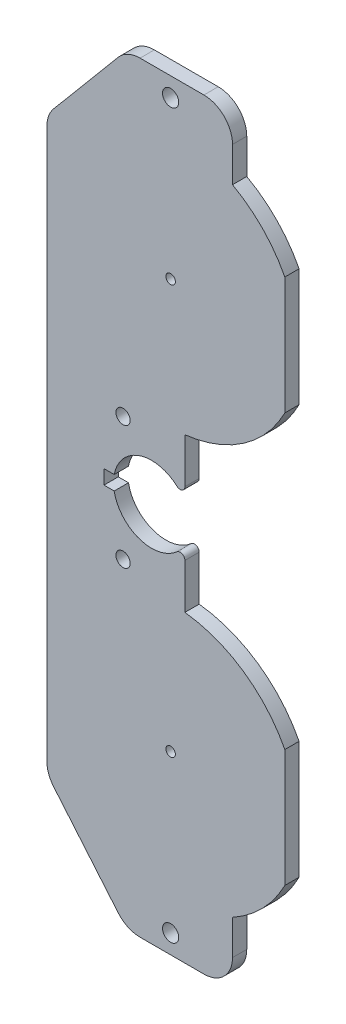
ISO-10303-21;
HEADER;
FILE_DESCRIPTION(('STEP AP214'),'2;1');
FILE_NAME('part.step','',(''),(''),'','','');
FILE_SCHEMA(('AUTOMOTIVE_DESIGN { 1 0 10303 214 1 1 1 1 }'));
ENDSEC;
DATA;
#1=APPLICATION_CONTEXT('core data for automotive mechanical design processes');
#2=APPLICATION_PROTOCOL_DEFINITION('international standard','automotive_design',2000,#1);
#3=PRODUCT_CONTEXT('',#1,'mechanical');
#4=PRODUCT('Part','Part','',(#3));
#5=PRODUCT_RELATED_PRODUCT_CATEGORY('part','',(#4));
#6=PRODUCT_DEFINITION_FORMATION('','',#4);
#7=PRODUCT_DEFINITION_CONTEXT('part definition',#1,'design');
#8=PRODUCT_DEFINITION('design','',#6,#7);
#9=PRODUCT_DEFINITION_SHAPE('','',#8);
#10=(LENGTH_UNIT() NAMED_UNIT(*) SI_UNIT(.MILLI.,.METRE.));
#11=(NAMED_UNIT(*) PLANE_ANGLE_UNIT() SI_UNIT($,.RADIAN.));
#12=(NAMED_UNIT(*) SI_UNIT($,.STERADIAN.) SOLID_ANGLE_UNIT());
#13=UNCERTAINTY_MEASURE_WITH_UNIT(LENGTH_MEASURE(1.E-05),#10,'distance_accuracy_value','');
#14=(GEOMETRIC_REPRESENTATION_CONTEXT(3) GLOBAL_UNCERTAINTY_ASSIGNED_CONTEXT((#13)) GLOBAL_UNIT_ASSIGNED_CONTEXT((#10,
#11,#12)) REPRESENTATION_CONTEXT('',''));
#15=CARTESIAN_POINT('',(0.,0.,0.));
#16=DIRECTION('',(0.,0.,1.));
#17=DIRECTION('',(1.,0.,0.));
#18=AXIS2_PLACEMENT_3D('',#15,#16,#17);
#19=CARTESIAN_POINT('',(-2.,38.,1.5));
#20=DIRECTION('',(0.,0.,-1.));
#21=DIRECTION('',(-1.,0.,0.));
#22=AXIS2_PLACEMENT_3D('',#19,#20,#21);
#23=CYLINDRICAL_SURFACE('',#22,4.);
#24=CARTESIAN_POINT('',(-2.,38.,1.5));
#25=DIRECTION('',(0.,0.,1.));
#26=DIRECTION('',(1.,0.,0.));
#27=AXIS2_PLACEMENT_3D('',#24,#25,#26);
#28=CIRCLE('',#27,4.);
#29=CARTESIAN_POINT('',(-5.92905841137543,37.25,1.5));
#30=VERTEX_POINT('',#29);
#31=CARTESIAN_POINT('',(0.666666666666667,35.0185760300003,1.5));
#32=VERTEX_POINT('',#31);
#33=EDGE_CURVE('E225',#30,#32,#28,.T.);
#34=ORIENTED_EDGE('',*,*,#33,.T.);
#35=DIRECTION('',(0.,0.,-1.));
#36=VECTOR('',#35,1.);
#37=CARTESIAN_POINT('',(0.666666666666667,35.0185760300003,1.5));
#38=LINE('',#37,#36);
#39=CARTESIAN_POINT('',(0.666666666666667,35.0185760300003,0.));
#40=VERTEX_POINT('',#39);
#41=EDGE_CURVE('E231',#32,#40,#38,.T.);
#42=ORIENTED_EDGE('',*,*,#41,.T.);
#43=CARTESIAN_POINT('',(-2.,38.,0.));
#44=DIRECTION('',(0.,0.,1.));
#45=DIRECTION('',(1.,0.,0.));
#46=AXIS2_PLACEMENT_3D('',#43,#44,#45);
#47=CIRCLE('',#46,4.);
#48=CARTESIAN_POINT('',(-5.92905841137543,37.25,0.));
#49=VERTEX_POINT('',#48);
#50=EDGE_CURVE('E228',#49,#40,#47,.T.);
#51=ORIENTED_EDGE('',*,*,#50,.F.);
#52=DIRECTION('',(0.,0.,-1.));
#53=VECTOR('',#52,1.);
#54=CARTESIAN_POINT('',(-5.92905841137543,37.25,1.5));
#55=LINE('',#54,#53);
#56=EDGE_CURVE('E221',#30,#49,#55,.T.);
#57=ORIENTED_EDGE('',*,*,#56,.F.);
#58=EDGE_LOOP('',(#34,#42,#51,#57));
#59=FACE_BOUND('',#58,.T.);
#60=ADVANCED_FACE('F37',(#59),#23,.F.);
#61=CARTESIAN_POINT('',(-2.41351910007069E-13,37.25,1.5));
#62=DIRECTION('',(0.,-1.,0.));
#63=DIRECTION('',(1.,0.,0.));
#64=AXIS2_PLACEMENT_3D('',#61,#62,#63);
#65=PLANE('',#64);
#66=DIRECTION('',(-1.,0.,0.));
#67=VECTOR('',#66,1.);
#68=CARTESIAN_POINT('',(-2.41351910007069E-13,37.25,0.));
#69=LINE('',#68,#67);
#70=CARTESIAN_POINT('',(-7.,37.25,0.));
#71=VERTEX_POINT('',#70);
#72=EDGE_CURVE('E326',#49,#71,#69,.T.);
#73=ORIENTED_EDGE('',*,*,#72,.T.);
#74=DIRECTION('',(0.,0.,-1.));
#75=VECTOR('',#74,1.);
#76=CARTESIAN_POINT('',(-7.,37.25,1.5));
#77=LINE('',#76,#75);
#78=CARTESIAN_POINT('',(-7.,37.25,1.5));
#79=VERTEX_POINT('',#78);
#80=EDGE_CURVE('E232',#79,#71,#77,.T.);
#81=ORIENTED_EDGE('',*,*,#80,.F.);
#82=DIRECTION('',(-1.,0.,0.));
#83=VECTOR('',#82,1.);
#84=CARTESIAN_POINT('',(-2.41351910007069E-13,37.25,1.5));
#85=LINE('',#84,#83);
#86=EDGE_CURVE('E235',#30,#79,#85,.T.);
#87=ORIENTED_EDGE('',*,*,#86,.F.);
#88=ORIENTED_EDGE('',*,*,#56,.T.);
#89=EDGE_LOOP('',(#73,#81,#87,#88));
#90=FACE_BOUND('',#89,.T.);
#91=ADVANCED_FACE('F236',(#90),#65,.F.);
#92=CARTESIAN_POINT('',(-7.,0.,1.5));
#93=DIRECTION('',(-1.,0.,0.));
#94=DIRECTION('',(0.,0.,1.));
#95=AXIS2_PLACEMENT_3D('',#92,#93,#94);
#96=PLANE('',#95);
#97=DIRECTION('',(0.,1.,0.));
#98=VECTOR('',#97,1.);
#99=CARTESIAN_POINT('',(-7.,0.,0.));
#100=LINE('',#99,#98);
#101=CARTESIAN_POINT('',(-7.,38.75,0.));
#102=VERTEX_POINT('',#101);
#103=EDGE_CURVE('E328',#71,#102,#100,.T.);
#104=ORIENTED_EDGE('',*,*,#103,.T.);
#105=DIRECTION('',(0.,0.,-1.));
#106=VECTOR('',#105,1.);
#107=CARTESIAN_POINT('',(-7.,38.75,1.5));
#108=LINE('',#107,#106);
#109=CARTESIAN_POINT('',(-7.,38.75,1.5));
#110=VERTEX_POINT('',#109);
#111=EDGE_CURVE('E454',#110,#102,#108,.T.);
#112=ORIENTED_EDGE('',*,*,#111,.F.);
#113=DIRECTION('',(0.,1.,0.));
#114=VECTOR('',#113,1.);
#115=CARTESIAN_POINT('',(-7.,0.,1.5));
#116=LINE('',#115,#114);
#117=EDGE_CURVE('E239',#79,#110,#116,.T.);
#118=ORIENTED_EDGE('',*,*,#117,.F.);
#119=ORIENTED_EDGE('',*,*,#80,.T.);
#120=EDGE_LOOP('',(#104,#112,#118,#119));
#121=FACE_BOUND('',#120,.T.);
#122=ADVANCED_FACE('F574',(#121),#96,.F.);
#123=CARTESIAN_POINT('',(2.51070778866413E-13,38.75,1.5));
#124=DIRECTION('',(0.,1.,0.));
#125=DIRECTION('',(-1.,0.,0.));
#126=AXIS2_PLACEMENT_3D('',#123,#124,#125);
#127=PLANE('',#126);
#128=DIRECTION('',(1.,0.,0.));
#129=VECTOR('',#128,1.);
#130=CARTESIAN_POINT('',(2.51070778866413E-13,38.75,0.));
#131=LINE('',#130,#129);
#132=CARTESIAN_POINT('',(-5.92905841137543,38.75,0.));
#133=VERTEX_POINT('',#132);
#134=EDGE_CURVE('E330',#102,#133,#131,.T.);
#135=ORIENTED_EDGE('',*,*,#134,.T.);
#136=DIRECTION('',(0.,0.,-1.));
#137=VECTOR('',#136,1.);
#138=CARTESIAN_POINT('',(-5.92905841137543,38.75,1.5));
#139=LINE('',#138,#137);
#140=CARTESIAN_POINT('',(-5.92905841137543,38.75,1.5));
#141=VERTEX_POINT('',#140);
#142=EDGE_CURVE('E451',#141,#133,#139,.T.);
#143=ORIENTED_EDGE('',*,*,#142,.F.);
#144=DIRECTION('',(1.,0.,0.));
#145=VECTOR('',#144,1.);
#146=CARTESIAN_POINT('',(2.51070778866413E-13,38.75,1.5));
#147=LINE('',#146,#145);
#148=EDGE_CURVE('E253',#110,#141,#147,.T.);
#149=ORIENTED_EDGE('',*,*,#148,.F.);
#150=ORIENTED_EDGE('',*,*,#111,.T.);
#151=EDGE_LOOP('',(#135,#143,#149,#150));
#152=FACE_BOUND('',#151,.T.);
#153=ADVANCED_FACE('F579',(#152),#127,.F.);
#154=CARTESIAN_POINT('',(-2.,38.,1.5));
#155=DIRECTION('',(0.,0.,-1.));
#156=DIRECTION('',(-1.,0.,0.));
#157=AXIS2_PLACEMENT_3D('',#154,#155,#156);
#158=CYLINDRICAL_SURFACE('',#157,4.);
#159=CARTESIAN_POINT('',(-2.,38.,0.));
#160=DIRECTION('',(0.,0.,1.));
#161=DIRECTION('',(1.,0.,0.));
#162=AXIS2_PLACEMENT_3D('',#159,#160,#161);
#163=CIRCLE('',#162,4.);
#164=CARTESIAN_POINT('',(0.666666666666667,40.9814239699997,0.));
#165=VERTEX_POINT('',#164);
#166=EDGE_CURVE('E333',#165,#133,#163,.T.);
#167=ORIENTED_EDGE('',*,*,#166,.F.);
#168=DIRECTION('',(0.,0.,-1.));
#169=VECTOR('',#168,1.);
#170=CARTESIAN_POINT('',(0.666666666666667,40.9814239699997,1.5));
#171=LINE('',#170,#169);
#172=CARTESIAN_POINT('',(0.666666666666667,40.9814239699997,1.5));
#173=VERTEX_POINT('',#172);
#174=EDGE_CURVE('E11',#165,#173,#171,.F.);
#175=ORIENTED_EDGE('',*,*,#174,.T.);
#176=CARTESIAN_POINT('',(-2.,38.,1.5));
#177=DIRECTION('',(0.,0.,1.));
#178=DIRECTION('',(1.,0.,0.));
#179=AXIS2_PLACEMENT_3D('',#176,#177,#178);
#180=CIRCLE('',#179,4.);
#181=EDGE_CURVE('E256',#173,#141,#180,.T.);
#182=ORIENTED_EDGE('',*,*,#181,.T.);
#183=ORIENTED_EDGE('',*,*,#142,.T.);
#184=EDGE_LOOP('',(#167,#175,#182,#183));
#185=FACE_BOUND('',#184,.T.);
#186=ADVANCED_FACE('F580',(#185),#158,.F.);
#187=CARTESIAN_POINT('',(1.5,0.,1.5));
#188=DIRECTION('',(-1.,0.,0.));
#189=DIRECTION('',(0.,-1.,0.));
#190=AXIS2_PLACEMENT_3D('',#187,#188,#189);
#191=PLANE('',#190);
#192=DIRECTION('',(0.,1.,0.));
#193=VECTOR('',#192,1.);
#194=CARTESIAN_POINT('',(1.5,0.,1.5));
#195=LINE('',#194,#193);
#196=CARTESIAN_POINT('',(1.5,41.3541019662497,1.5));
#197=VERTEX_POINT('',#196);
#198=CARTESIAN_POINT('',(1.5,46.0835921350013,1.5));
#199=VERTEX_POINT('',#198);
#200=EDGE_CURVE('E258',#197,#199,#195,.T.);
#201=ORIENTED_EDGE('',*,*,#200,.F.);
#202=DIRECTION('',(0.,0.,1.));
#203=VECTOR('',#202,1.);
#204=CARTESIAN_POINT('',(1.5,41.3541019662497,0.));
#205=LINE('',#204,#203);
#206=CARTESIAN_POINT('',(1.5,41.3541019662497,0.));
#207=VERTEX_POINT('',#206);
#208=EDGE_CURVE('E45',#197,#207,#205,.F.);
#209=ORIENTED_EDGE('',*,*,#208,.T.);
#210=DIRECTION('',(0.,1.,0.));
#211=VECTOR('',#210,1.);
#212=CARTESIAN_POINT('',(1.5,0.,0.));
#213=LINE('',#212,#211);
#214=CARTESIAN_POINT('',(1.5,46.0835921350013,0.));
#215=VERTEX_POINT('',#214);
#216=EDGE_CURVE('E335',#207,#215,#213,.T.);
#217=ORIENTED_EDGE('',*,*,#216,.T.);
#218=DIRECTION('',(0.,0.,-1.));
#219=VECTOR('',#218,1.);
#220=CARTESIAN_POINT('',(1.5,46.0835921350013,1.5));
#221=LINE('',#220,#219);
#222=EDGE_CURVE('E448',#199,#215,#221,.T.);
#223=ORIENTED_EDGE('',*,*,#222,.F.);
#224=EDGE_LOOP('',(#201,#209,#217,#223));
#225=FACE_BOUND('',#224,.T.);
#226=ADVANCED_FACE('F470',(#225),#191,.F.);
#227=CARTESIAN_POINT('',(0.,59.5,1.5));
#228=DIRECTION('',(0.,0.,-1.));
#229=DIRECTION('',(-1.,0.,0.));
#230=AXIS2_PLACEMENT_3D('',#227,#228,#229);
#231=CYLINDRICAL_SURFACE('',#230,13.5);
#232=CARTESIAN_POINT('',(0.,59.5,0.));
#233=DIRECTION('',(0.,0.,1.));
#234=DIRECTION('',(1.,0.,0.));
#235=AXIS2_PLACEMENT_3D('',#232,#233,#234);
#236=CIRCLE('',#235,13.5);
#237=CARTESIAN_POINT('',(12.,53.3153415615735,0.));
#238=VERTEX_POINT('',#237);
#239=EDGE_CURVE('E337',#215,#238,#236,.T.);
#240=ORIENTED_EDGE('',*,*,#239,.T.);
#241=DIRECTION('',(0.,0.,-1.));
#242=VECTOR('',#241,1.);
#243=CARTESIAN_POINT('',(12.,53.3153415615735,1.5));
#244=LINE('',#243,#242);
#245=CARTESIAN_POINT('',(12.,53.3153415615735,1.5));
#246=VERTEX_POINT('',#245);
#247=EDGE_CURVE('E445',#246,#238,#244,.T.);
#248=ORIENTED_EDGE('',*,*,#247,.F.);
#249=CARTESIAN_POINT('',(0.,59.5,1.5));
#250=DIRECTION('',(0.,0.,1.));
#251=DIRECTION('',(1.,0.,0.));
#252=AXIS2_PLACEMENT_3D('',#249,#250,#251);
#253=CIRCLE('',#252,13.5);
#254=EDGE_CURVE('E260',#199,#246,#253,.T.);
#255=ORIENTED_EDGE('',*,*,#254,.F.);
#256=ORIENTED_EDGE('',*,*,#222,.T.);
#257=EDGE_LOOP('',(#240,#248,#255,#256));
#258=FACE_BOUND('',#257,.T.);
#259=ADVANCED_FACE('F481',(#258),#231,.T.);
#260=CARTESIAN_POINT('',(12.,0.,1.5));
#261=DIRECTION('',(-1.,0.,0.));
#262=DIRECTION('',(0.,0.,1.));
#263=AXIS2_PLACEMENT_3D('',#260,#261,#262);
#264=PLANE('',#263);
#265=DIRECTION('',(0.,1.,0.));
#266=VECTOR('',#265,1.);
#267=CARTESIAN_POINT('',(12.,0.,0.));
#268=LINE('',#267,#266);
#269=CARTESIAN_POINT('',(12.,65.6846584384265,0.));
#270=VERTEX_POINT('',#269);
#271=EDGE_CURVE('E339',#238,#270,#268,.T.);
#272=ORIENTED_EDGE('',*,*,#271,.T.);
#273=DIRECTION('',(0.,0.,-1.));
#274=VECTOR('',#273,1.);
#275=CARTESIAN_POINT('',(12.,65.6846584384265,1.5));
#276=LINE('',#275,#274);
#277=CARTESIAN_POINT('',(12.,65.6846584384265,1.5));
#278=VERTEX_POINT('',#277);
#279=EDGE_CURVE('E442',#278,#270,#276,.T.);
#280=ORIENTED_EDGE('',*,*,#279,.F.);
#281=DIRECTION('',(0.,1.,0.));
#282=VECTOR('',#281,1.);
#283=CARTESIAN_POINT('',(12.,0.,1.5));
#284=LINE('',#283,#282);
#285=EDGE_CURVE('E262',#246,#278,#284,.T.);
#286=ORIENTED_EDGE('',*,*,#285,.F.);
#287=ORIENTED_EDGE('',*,*,#247,.T.);
#288=EDGE_LOOP('',(#272,#280,#286,#287));
#289=FACE_BOUND('',#288,.T.);
#290=ADVANCED_FACE('F485',(#289),#264,.F.);
#291=CARTESIAN_POINT('',(0.,59.5,1.5));
#292=DIRECTION('',(0.,0.,-1.));
#293=DIRECTION('',(-1.,0.,0.));
#294=AXIS2_PLACEMENT_3D('',#291,#292,#293);
#295=CYLINDRICAL_SURFACE('',#294,13.5);
#296=CARTESIAN_POINT('',(0.,59.5,0.));
#297=DIRECTION('',(0.,0.,1.));
#298=DIRECTION('',(1.,0.,0.));
#299=AXIS2_PLACEMENT_3D('',#296,#297,#298);
#300=CIRCLE('',#299,13.5);
#301=CARTESIAN_POINT('',(6.5,71.3321595661992,0.));
#302=VERTEX_POINT('',#301);
#303=EDGE_CURVE('E341',#270,#302,#300,.T.);
#304=ORIENTED_EDGE('',*,*,#303,.T.);
#305=DIRECTION('',(0.,0.,-1.));
#306=VECTOR('',#305,1.);
#307=CARTESIAN_POINT('',(6.5,71.3321595661992,1.5));
#308=LINE('',#307,#306);
#309=CARTESIAN_POINT('',(6.5,71.3321595661992,1.5));
#310=VERTEX_POINT('',#309);
#311=EDGE_CURVE('E439',#310,#302,#308,.T.);
#312=ORIENTED_EDGE('',*,*,#311,.F.);
#313=CARTESIAN_POINT('',(0.,59.5,1.5));
#314=DIRECTION('',(0.,0.,1.));
#315=DIRECTION('',(1.,0.,0.));
#316=AXIS2_PLACEMENT_3D('',#313,#314,#315);
#317=CIRCLE('',#316,13.5);
#318=EDGE_CURVE('E264',#278,#310,#317,.T.);
#319=ORIENTED_EDGE('',*,*,#318,.F.);
#320=ORIENTED_EDGE('',*,*,#279,.T.);
#321=EDGE_LOOP('',(#304,#312,#319,#320));
#322=FACE_BOUND('',#321,.T.);
#323=ADVANCED_FACE('F492',(#322),#295,.T.);
#324=CARTESIAN_POINT('',(6.50000000000002,0.,1.5));
#325=DIRECTION('',(-1.,0.,0.));
#326=DIRECTION('',(0.,-1.,0.));
#327=AXIS2_PLACEMENT_3D('',#324,#325,#326);
#328=PLANE('',#327);
#329=DIRECTION('',(0.,1.,0.));
#330=VECTOR('',#329,1.);
#331=CARTESIAN_POINT('',(6.50000000000002,0.,0.));
#332=LINE('',#331,#330);
#333=CARTESIAN_POINT('',(6.5,75.,0.));
#334=VERTEX_POINT('',#333);
#335=EDGE_CURVE('E343',#302,#334,#332,.T.);
#336=ORIENTED_EDGE('',*,*,#335,.T.);
#337=DIRECTION('',(0.,0.,-1.));
#338=VECTOR('',#337,1.);
#339=CARTESIAN_POINT('',(6.5,75.,1.5));
#340=LINE('',#339,#338);
#341=CARTESIAN_POINT('',(6.5,75.,1.5));
#342=VERTEX_POINT('',#341);
#343=EDGE_CURVE('E436',#342,#334,#340,.T.);
#344=ORIENTED_EDGE('',*,*,#343,.F.);
#345=DIRECTION('',(0.,1.,0.));
#346=VECTOR('',#345,1.);
#347=CARTESIAN_POINT('',(6.50000000000002,0.,1.5));
#348=LINE('',#347,#346);
#349=EDGE_CURVE('E266',#310,#342,#348,.T.);
#350=ORIENTED_EDGE('',*,*,#349,.F.);
#351=ORIENTED_EDGE('',*,*,#311,.T.);
#352=EDGE_LOOP('',(#336,#344,#350,#351));
#353=FACE_BOUND('',#352,.T.);
#354=ADVANCED_FACE('F495',(#353),#328,.F.);
#355=CARTESIAN_POINT('',(3.49999999999999,75.,1.5));
#356=DIRECTION('',(0.,0.,-1.));
#357=DIRECTION('',(-1.,0.,0.));
#358=AXIS2_PLACEMENT_3D('',#355,#356,#357);
#359=CYLINDRICAL_SURFACE('',#358,3.);
#360=CARTESIAN_POINT('',(3.49999999999999,75.,0.));
#361=DIRECTION('',(0.,0.,1.));
#362=DIRECTION('',(1.,0.,0.));
#363=AXIS2_PLACEMENT_3D('',#360,#361,#362);
#364=CIRCLE('',#363,3.);
#365=CARTESIAN_POINT('',(3.49999999999999,78.,0.));
#366=VERTEX_POINT('',#365);
#367=EDGE_CURVE('E345',#334,#366,#364,.T.);
#368=ORIENTED_EDGE('',*,*,#367,.T.);
#369=DIRECTION('',(0.,0.,-1.));
#370=VECTOR('',#369,1.);
#371=CARTESIAN_POINT('',(3.49999999999999,78.,1.5));
#372=LINE('',#371,#370);
#373=CARTESIAN_POINT('',(3.49999999999999,78.,1.5));
#374=VERTEX_POINT('',#373);
#375=EDGE_CURVE('E433',#374,#366,#372,.T.);
#376=ORIENTED_EDGE('',*,*,#375,.F.);
#377=CARTESIAN_POINT('',(3.49999999999999,75.,1.5));
#378=DIRECTION('',(0.,0.,1.));
#379=DIRECTION('',(1.,0.,0.));
#380=AXIS2_PLACEMENT_3D('',#377,#378,#379);
#381=CIRCLE('',#380,3.);
#382=EDGE_CURVE('E268',#342,#374,#381,.T.);
#383=ORIENTED_EDGE('',*,*,#382,.F.);
#384=ORIENTED_EDGE('',*,*,#343,.T.);
#385=EDGE_LOOP('',(#368,#376,#383,#384));
#386=FACE_BOUND('',#385,.T.);
#387=ADVANCED_FACE('F500',(#386),#359,.T.);
#388=CARTESIAN_POINT('',(0.,78.,1.5));
#389=DIRECTION('',(0.,-1.,0.));
#390=DIRECTION('',(0.,0.,-1.));
#391=AXIS2_PLACEMENT_3D('',#388,#389,#390);
#392=PLANE('',#391);
#393=DIRECTION('',(-1.,0.,0.));
#394=VECTOR('',#393,1.);
#395=CARTESIAN_POINT('',(0.,78.,0.));
#396=LINE('',#395,#394);
#397=CARTESIAN_POINT('',(-3.21008071376217,78.,0.));
#398=VERTEX_POINT('',#397);
#399=EDGE_CURVE('E347',#366,#398,#396,.T.);
#400=ORIENTED_EDGE('',*,*,#399,.T.);
#401=DIRECTION('',(0.,0.,-1.));
#402=VECTOR('',#401,1.);
#403=CARTESIAN_POINT('',(-3.21008071376217,78.,1.5));
#404=LINE('',#403,#402);
#405=CARTESIAN_POINT('',(-3.21008071376217,78.,1.5));
#406=VERTEX_POINT('',#405);
#407=EDGE_CURVE('E430',#406,#398,#404,.T.);
#408=ORIENTED_EDGE('',*,*,#407,.F.);
#409=DIRECTION('',(-1.,0.,0.));
#410=VECTOR('',#409,1.);
#411=CARTESIAN_POINT('',(0.,78.,1.5));
#412=LINE('',#411,#410);
#413=EDGE_CURVE('E270',#374,#406,#412,.T.);
#414=ORIENTED_EDGE('',*,*,#413,.F.);
#415=ORIENTED_EDGE('',*,*,#375,.T.);
#416=EDGE_LOOP('',(#400,#408,#414,#415));
#417=FACE_BOUND('',#416,.T.);
#418=ADVANCED_FACE('F507',(#417),#392,.F.);
#419=CARTESIAN_POINT('',(-3.21008071376217,75.,1.5));
#420=DIRECTION('',(0.,0.,-1.));
#421=DIRECTION('',(-1.,0.,0.));
#422=AXIS2_PLACEMENT_3D('',#419,#420,#421);
#423=CYLINDRICAL_SURFACE('',#422,3.);
#424=CARTESIAN_POINT('',(-3.21008071376217,75.,0.));
#425=DIRECTION('',(0.,0.,1.));
#426=DIRECTION('',(1.,0.,0.));
#427=AXIS2_PLACEMENT_3D('',#424,#425,#426);
#428=CIRCLE('',#427,3.);
#429=CARTESIAN_POINT('',(-5.50821404311911,76.9283628290596,0.));
#430=VERTEX_POINT('',#429);
#431=EDGE_CURVE('E349',#398,#430,#428,.T.);
#432=ORIENTED_EDGE('',*,*,#431,.T.);
#433=DIRECTION('',(0.,0.,-1.));
#434=VECTOR('',#433,1.);
#435=CARTESIAN_POINT('',(-5.50821404311911,76.9283628290596,1.5));
#436=LINE('',#435,#434);
#437=CARTESIAN_POINT('',(-5.50821404311911,76.9283628290596,1.5));
#438=VERTEX_POINT('',#437);
#439=EDGE_CURVE('E428',#438,#430,#436,.T.);
#440=ORIENTED_EDGE('',*,*,#439,.F.);
#441=CARTESIAN_POINT('',(-3.21008071376217,75.,1.5));
#442=DIRECTION('',(0.,0.,1.));
#443=DIRECTION('',(1.,0.,0.));
#444=AXIS2_PLACEMENT_3D('',#441,#442,#443);
#445=CIRCLE('',#444,3.);
#446=EDGE_CURVE('E272',#406,#438,#445,.T.);
#447=ORIENTED_EDGE('',*,*,#446,.F.);
#448=ORIENTED_EDGE('',*,*,#407,.T.);
#449=EDGE_LOOP('',(#432,#440,#447,#448));
#450=FACE_BOUND('',#449,.T.);
#451=ADVANCED_FACE('F511',(#450),#423,.T.);
#452=CARTESIAN_POINT('',(-41.1121767572501,34.4972123539038,1.5));
#453=DIRECTION('',(-0.766044443118977,0.64278760968654,0.));
#454=DIRECTION('',(-0.64278760968654,-0.766044443118977,0.));
#455=AXIS2_PLACEMENT_3D('',#452,#453,#454);
#456=PLANE('',#455);
#457=DIRECTION('',(0.64278760968654,0.766044443118977,0.));
#458=VECTOR('',#457,1.);
#459=CARTESIAN_POINT('',(-41.1121767572501,34.4972123539038,0.));
#460=LINE('',#459,#458);
#461=CARTESIAN_POINT('',(-12.2981333293569,68.836452126261,0.));
#462=VERTEX_POINT('',#461);
#463=EDGE_CURVE('E352',#462,#430,#460,.T.);
#464=ORIENTED_EDGE('',*,*,#463,.F.);
#465=DIRECTION('',(0.,0.,-1.));
#466=VECTOR('',#465,1.);
#467=CARTESIAN_POINT('',(-12.2981333293569,68.836452126261,1.5));
#468=LINE('',#467,#466);
#469=CARTESIAN_POINT('',(-12.2981333293569,68.836452126261,1.5));
#470=VERTEX_POINT('',#469);
#471=EDGE_CURVE('E426',#470,#462,#468,.T.);
#472=ORIENTED_EDGE('',*,*,#471,.F.);
#473=DIRECTION('',(0.64278760968654,0.766044443118977,0.));
#474=VECTOR('',#473,1.);
#475=CARTESIAN_POINT('',(-41.1121767572501,34.4972123539038,1.5));
#476=LINE('',#475,#474);
#477=EDGE_CURVE('E274',#470,#438,#476,.T.);
#478=ORIENTED_EDGE('',*,*,#477,.T.);
#479=ORIENTED_EDGE('',*,*,#439,.T.);
#480=EDGE_LOOP('',(#464,#472,#478,#479));
#481=FACE_BOUND('',#480,.T.);
#482=ADVANCED_FACE('F514',(#481),#456,.T.);
#483=CARTESIAN_POINT('',(-10.,66.9080892972014,1.5));
#484=DIRECTION('',(0.,0.,-1.));
#485=DIRECTION('',(-1.,0.,0.));
#486=AXIS2_PLACEMENT_3D('',#483,#484,#485);
#487=CYLINDRICAL_SURFACE('',#486,3.);
#488=CARTESIAN_POINT('',(-10.,66.9080892972014,0.));
#489=DIRECTION('',(0.,0.,1.));
#490=DIRECTION('',(1.,0.,0.));
#491=AXIS2_PLACEMENT_3D('',#488,#489,#490);
#492=CIRCLE('',#491,3.);
#493=CARTESIAN_POINT('',(-13.,66.9080892972014,0.));
#494=VERTEX_POINT('',#493);
#495=EDGE_CURVE('E355',#494,#462,#492,.F.);
#496=ORIENTED_EDGE('',*,*,#495,.F.);
#497=DIRECTION('',(0.,0.,-1.));
#498=VECTOR('',#497,1.);
#499=CARTESIAN_POINT('',(-13.,66.9080892972014,1.5));
#500=LINE('',#499,#498);
#501=CARTESIAN_POINT('',(-13.,66.9080892972014,1.5));
#502=VERTEX_POINT('',#501);
#503=EDGE_CURVE('E424',#502,#494,#500,.T.);
#504=ORIENTED_EDGE('',*,*,#503,.F.);
#505=CARTESIAN_POINT('',(-10.,66.9080892972014,1.5));
#506=DIRECTION('',(0.,0.,1.));
#507=DIRECTION('',(1.,0.,0.));
#508=AXIS2_PLACEMENT_3D('',#505,#506,#507);
#509=CIRCLE('',#508,3.);
#510=EDGE_CURVE('E277',#502,#470,#509,.F.);
#511=ORIENTED_EDGE('',*,*,#510,.T.);
#512=ORIENTED_EDGE('',*,*,#471,.T.);
#513=EDGE_LOOP('',(#496,#504,#511,#512));
#514=FACE_BOUND('',#513,.T.);
#515=ADVANCED_FACE('F519',(#514),#487,.T.);
#516=CARTESIAN_POINT('',(-13.,0.,1.5));
#517=DIRECTION('',(-1.,0.,0.));
#518=DIRECTION('',(0.,0.,1.));
#519=AXIS2_PLACEMENT_3D('',#516,#517,#518);
#520=PLANE('',#519);
#521=DIRECTION('',(0.,1.,0.));
#522=VECTOR('',#521,1.);
#523=CARTESIAN_POINT('',(-13.,0.,0.));
#524=LINE('',#523,#522);
#525=CARTESIAN_POINT('',(-13.,9.09191070279862,0.));
#526=VERTEX_POINT('',#525);
#527=EDGE_CURVE('E358',#526,#494,#524,.T.);
#528=ORIENTED_EDGE('',*,*,#527,.F.);
#529=DIRECTION('',(0.,0.,-1.));
#530=VECTOR('',#529,1.);
#531=CARTESIAN_POINT('',(-13.,9.09191070279862,1.5));
#532=LINE('',#531,#530);
#533=CARTESIAN_POINT('',(-13.,9.09191070279862,1.5));
#534=VERTEX_POINT('',#533);
#535=EDGE_CURVE('E422',#534,#526,#532,.T.);
#536=ORIENTED_EDGE('',*,*,#535,.F.);
#537=DIRECTION('',(0.,1.,0.));
#538=VECTOR('',#537,1.);
#539=CARTESIAN_POINT('',(-13.,0.,1.5));
#540=LINE('',#539,#538);
#541=EDGE_CURVE('E280',#534,#502,#540,.T.);
#542=ORIENTED_EDGE('',*,*,#541,.T.);
#543=ORIENTED_EDGE('',*,*,#503,.T.);
#544=EDGE_LOOP('',(#528,#536,#542,#543));
#545=FACE_BOUND('',#544,.T.);
#546=ADVANCED_FACE('F522',(#545),#520,.T.);
#547=CARTESIAN_POINT('',(-10.,9.09191070279862,1.5));
#548=DIRECTION('',(0.,0.,-1.));
#549=DIRECTION('',(-1.,0.,0.));
#550=AXIS2_PLACEMENT_3D('',#547,#548,#549);
#551=CYLINDRICAL_SURFACE('',#550,3.00000000000001);
#552=CARTESIAN_POINT('',(-10.,9.09191070279862,0.));
#553=DIRECTION('',(0.,0.,1.));
#554=DIRECTION('',(1.,0.,0.));
#555=AXIS2_PLACEMENT_3D('',#552,#553,#554);
#556=CIRCLE('',#555,3.00000000000001);
#557=CARTESIAN_POINT('',(-12.2981333293569,7.16354787373899,0.));
#558=VERTEX_POINT('',#557);
#559=EDGE_CURVE('E361',#526,#558,#556,.T.);
#560=ORIENTED_EDGE('',*,*,#559,.T.);
#561=DIRECTION('',(0.,0.,-1.));
#562=VECTOR('',#561,1.);
#563=CARTESIAN_POINT('',(-12.2981333293569,7.16354787373899,1.5));
#564=LINE('',#563,#562);
#565=CARTESIAN_POINT('',(-12.2981333293569,7.16354787373899,1.5));
#566=VERTEX_POINT('',#565);
#567=EDGE_CURVE('E419',#566,#558,#564,.T.);
#568=ORIENTED_EDGE('',*,*,#567,.F.);
#569=CARTESIAN_POINT('',(-10.,9.09191070279862,1.5));
#570=DIRECTION('',(0.,0.,1.));
#571=DIRECTION('',(1.,0.,0.));
#572=AXIS2_PLACEMENT_3D('',#569,#570,#571);
#573=CIRCLE('',#572,3.00000000000001);
#574=EDGE_CURVE('E283',#534,#566,#573,.T.);
#575=ORIENTED_EDGE('',*,*,#574,.F.);
#576=ORIENTED_EDGE('',*,*,#535,.T.);
#577=EDGE_LOOP('',(#560,#568,#575,#576));
#578=FACE_BOUND('',#577,.T.);
#579=ADVANCED_FACE('F529',(#578),#551,.T.);
#580=CARTESIAN_POINT('',(-3.68948214278619,-3.09584310524707,1.5));
#581=DIRECTION('',(0.766044443118977,0.642787609686541,0.));
#582=DIRECTION('',(-0.642787609686541,0.766044443118977,0.));
#583=AXIS2_PLACEMENT_3D('',#580,#581,#582);
#584=PLANE('',#583);
#585=DIRECTION('',(0.642787609686541,-0.766044443118977,0.));
#586=VECTOR('',#585,1.);
#587=CARTESIAN_POINT('',(-3.68948214278619,-3.09584310524707,0.));
#588=LINE('',#587,#586);
#589=CARTESIAN_POINT('',(-5.50821404311911,-0.928362829059626,0.));
#590=VERTEX_POINT('',#589);
#591=EDGE_CURVE('E363',#558,#590,#588,.T.);
#592=ORIENTED_EDGE('',*,*,#591,.T.);
#593=DIRECTION('',(0.,0.,-1.));
#594=VECTOR('',#593,1.);
#595=CARTESIAN_POINT('',(-5.50821404311911,-0.928362829059626,1.5));
#596=LINE('',#595,#594);
#597=CARTESIAN_POINT('',(-5.50821404311911,-0.928362829059626,1.5));
#598=VERTEX_POINT('',#597);
#599=EDGE_CURVE('E417',#598,#590,#596,.T.);
#600=ORIENTED_EDGE('',*,*,#599,.F.);
#601=DIRECTION('',(0.642787609686541,-0.766044443118977,0.));
#602=VECTOR('',#601,1.);
#603=CARTESIAN_POINT('',(-3.68948214278619,-3.09584310524707,1.5));
#604=LINE('',#603,#602);
#605=EDGE_CURVE('E285',#566,#598,#604,.T.);
#606=ORIENTED_EDGE('',*,*,#605,.F.);
#607=ORIENTED_EDGE('',*,*,#567,.T.);
#608=EDGE_LOOP('',(#592,#600,#606,#607));
#609=FACE_BOUND('',#608,.T.);
#610=ADVANCED_FACE('F533',(#609),#584,.F.);
#611=CARTESIAN_POINT('',(-3.21008071376217,0.999999999999999,1.5));
#612=DIRECTION('',(0.,0.,-1.));
#613=DIRECTION('',(-1.,0.,0.));
#614=AXIS2_PLACEMENT_3D('',#611,#612,#613);
#615=CYLINDRICAL_SURFACE('',#614,3.);
#616=CARTESIAN_POINT('',(-3.21008071376217,0.999999999999999,0.));
#617=DIRECTION('',(0.,0.,1.));
#618=DIRECTION('',(1.,0.,0.));
#619=AXIS2_PLACEMENT_3D('',#616,#617,#618);
#620=CIRCLE('',#619,3.);
#621=CARTESIAN_POINT('',(-3.21008071376214,-2.,0.));
#622=VERTEX_POINT('',#621);
#623=EDGE_CURVE('E366',#622,#590,#620,.F.);
#624=ORIENTED_EDGE('',*,*,#623,.F.);
#625=DIRECTION('',(0.,0.,-1.));
#626=VECTOR('',#625,1.);
#627=CARTESIAN_POINT('',(-3.21008071376214,-2.,1.5));
#628=LINE('',#627,#626);
#629=CARTESIAN_POINT('',(-3.21008071376214,-2.,1.5));
#630=VERTEX_POINT('',#629);
#631=EDGE_CURVE('E415',#630,#622,#628,.T.);
#632=ORIENTED_EDGE('',*,*,#631,.F.);
#633=CARTESIAN_POINT('',(-3.21008071376217,0.999999999999999,1.5));
#634=DIRECTION('',(0.,0.,1.));
#635=DIRECTION('',(1.,0.,0.));
#636=AXIS2_PLACEMENT_3D('',#633,#634,#635);
#637=CIRCLE('',#636,3.);
#638=EDGE_CURVE('E287',#630,#598,#637,.F.);
#639=ORIENTED_EDGE('',*,*,#638,.T.);
#640=ORIENTED_EDGE('',*,*,#599,.T.);
#641=EDGE_LOOP('',(#624,#632,#639,#640));
#642=FACE_BOUND('',#641,.T.);
#643=ADVANCED_FACE('F536',(#642),#615,.T.);
#644=CARTESIAN_POINT('',(0.,-2.,1.5));
#645=DIRECTION('',(0.,1.,0.));
#646=DIRECTION('',(-1.,0.,0.));
#647=AXIS2_PLACEMENT_3D('',#644,#645,#646);
#648=PLANE('',#647);
#649=DIRECTION('',(1.,0.,0.));
#650=VECTOR('',#649,1.);
#651=CARTESIAN_POINT('',(0.,-2.,0.));
#652=LINE('',#651,#650);
#653=CARTESIAN_POINT('',(3.49999999999999,-2.,0.));
#654=VERTEX_POINT('',#653);
#655=EDGE_CURVE('E369',#622,#654,#652,.T.);
#656=ORIENTED_EDGE('',*,*,#655,.T.);
#657=DIRECTION('',(0.,0.,-1.));
#658=VECTOR('',#657,1.);
#659=CARTESIAN_POINT('',(3.49999999999999,-2.,1.5));
#660=LINE('',#659,#658);
#661=CARTESIAN_POINT('',(3.49999999999999,-2.,1.5));
#662=VERTEX_POINT('',#661);
#663=EDGE_CURVE('E412',#662,#654,#660,.T.);
#664=ORIENTED_EDGE('',*,*,#663,.F.);
#665=DIRECTION('',(1.,0.,0.));
#666=VECTOR('',#665,1.);
#667=CARTESIAN_POINT('',(0.,-2.,1.5));
#668=LINE('',#667,#666);
#669=EDGE_CURVE('E290',#630,#662,#668,.T.);
#670=ORIENTED_EDGE('',*,*,#669,.F.);
#671=ORIENTED_EDGE('',*,*,#631,.T.);
#672=EDGE_LOOP('',(#656,#664,#670,#671));
#673=FACE_BOUND('',#672,.T.);
#674=ADVANCED_FACE('F543',(#673),#648,.F.);
#675=CARTESIAN_POINT('',(3.49999999999999,0.999999999999998,1.5));
#676=DIRECTION('',(0.,0.,-1.));
#677=DIRECTION('',(-1.,0.,0.));
#678=AXIS2_PLACEMENT_3D('',#675,#676,#677);
#679=CYLINDRICAL_SURFACE('',#678,3.);
#680=CARTESIAN_POINT('',(3.49999999999999,0.999999999999998,0.));
#681=DIRECTION('',(0.,0.,1.));
#682=DIRECTION('',(1.,0.,0.));
#683=AXIS2_PLACEMENT_3D('',#680,#681,#682);
#684=CIRCLE('',#683,3.);
#685=CARTESIAN_POINT('',(6.5,0.999999999999999,0.));
#686=VERTEX_POINT('',#685);
#687=EDGE_CURVE('E371',#654,#686,#684,.T.);
#688=ORIENTED_EDGE('',*,*,#687,.T.);
#689=DIRECTION('',(0.,0.,-1.));
#690=VECTOR('',#689,1.);
#691=CARTESIAN_POINT('',(6.5,0.999999999999999,1.5));
#692=LINE('',#691,#690);
#693=CARTESIAN_POINT('',(6.5,0.999999999999999,1.5));
#694=VERTEX_POINT('',#693);
#695=EDGE_CURVE('E410',#694,#686,#692,.T.);
#696=ORIENTED_EDGE('',*,*,#695,.F.);
#697=CARTESIAN_POINT('',(3.49999999999999,0.999999999999998,1.5));
#698=DIRECTION('',(0.,0.,1.));
#699=DIRECTION('',(1.,0.,0.));
#700=AXIS2_PLACEMENT_3D('',#697,#698,#699);
#701=CIRCLE('',#700,3.);
#702=EDGE_CURVE('E292',#662,#694,#701,.T.);
#703=ORIENTED_EDGE('',*,*,#702,.F.);
#704=ORIENTED_EDGE('',*,*,#663,.T.);
#705=EDGE_LOOP('',(#688,#696,#703,#704));
#706=FACE_BOUND('',#705,.T.);
#707=ADVANCED_FACE('F547',(#706),#679,.T.);
#708=CARTESIAN_POINT('',(6.5,0.,1.5));
#709=DIRECTION('',(1.,0.,0.));
#710=DIRECTION('',(0.,1.,0.));
#711=AXIS2_PLACEMENT_3D('',#708,#709,#710);
#712=PLANE('',#711);
#713=DIRECTION('',(0.,-1.,0.));
#714=VECTOR('',#713,1.);
#715=CARTESIAN_POINT('',(6.5,0.,0.));
#716=LINE('',#715,#714);
#717=CARTESIAN_POINT('',(6.5,4.66784043380077,0.));
#718=VERTEX_POINT('',#717);
#719=EDGE_CURVE('E374',#718,#686,#716,.T.);
#720=ORIENTED_EDGE('',*,*,#719,.F.);
#721=DIRECTION('',(0.,0.,-1.));
#722=VECTOR('',#721,1.);
#723=CARTESIAN_POINT('',(6.5,4.66784043380077,1.5));
#724=LINE('',#723,#722);
#725=CARTESIAN_POINT('',(6.5,4.66784043380077,1.5));
#726=VERTEX_POINT('',#725);
#727=EDGE_CURVE('E408',#726,#718,#724,.T.);
#728=ORIENTED_EDGE('',*,*,#727,.F.);
#729=DIRECTION('',(0.,-1.,0.));
#730=VECTOR('',#729,1.);
#731=CARTESIAN_POINT('',(6.5,0.,1.5));
#732=LINE('',#731,#730);
#733=EDGE_CURVE('E294',#726,#694,#732,.T.);
#734=ORIENTED_EDGE('',*,*,#733,.T.);
#735=ORIENTED_EDGE('',*,*,#695,.T.);
#736=EDGE_LOOP('',(#720,#728,#734,#735));
#737=FACE_BOUND('',#736,.T.);
#738=ADVANCED_FACE('F550',(#737),#712,.T.);
#739=CARTESIAN_POINT('',(0.,16.5,1.5));
#740=DIRECTION('',(0.,0.,-1.));
#741=DIRECTION('',(-1.,0.,0.));
#742=AXIS2_PLACEMENT_3D('',#739,#740,#741);
#743=CYLINDRICAL_SURFACE('',#742,13.5);
#744=CARTESIAN_POINT('',(0.,16.5,0.));
#745=DIRECTION('',(0.,0.,1.));
#746=DIRECTION('',(1.,0.,0.));
#747=AXIS2_PLACEMENT_3D('',#744,#745,#746);
#748=CIRCLE('',#747,13.5);
#749=CARTESIAN_POINT('',(12.,10.3153415615735,0.));
#750=VERTEX_POINT('',#749);
#751=EDGE_CURVE('E377',#718,#750,#748,.T.);
#752=ORIENTED_EDGE('',*,*,#751,.T.);
#753=DIRECTION('',(0.,0.,-1.));
#754=VECTOR('',#753,1.);
#755=CARTESIAN_POINT('',(12.,10.3153415615735,1.5));
#756=LINE('',#755,#754);
#757=CARTESIAN_POINT('',(12.,10.3153415615735,1.5));
#758=VERTEX_POINT('',#757);
#759=EDGE_CURVE('E405',#758,#750,#756,.T.);
#760=ORIENTED_EDGE('',*,*,#759,.F.);
#761=CARTESIAN_POINT('',(0.,16.5,1.5));
#762=DIRECTION('',(0.,0.,1.));
#763=DIRECTION('',(1.,0.,0.));
#764=AXIS2_PLACEMENT_3D('',#761,#762,#763);
#765=CIRCLE('',#764,13.5);
#766=EDGE_CURVE('E297',#726,#758,#765,.T.);
#767=ORIENTED_EDGE('',*,*,#766,.F.);
#768=ORIENTED_EDGE('',*,*,#727,.T.);
#769=EDGE_LOOP('',(#752,#760,#767,#768));
#770=FACE_BOUND('',#769,.T.);
#771=ADVANCED_FACE('F556',(#770),#743,.T.);
#772=CARTESIAN_POINT('',(12.,0.,1.5));
#773=DIRECTION('',(-1.,0.,0.));
#774=DIRECTION('',(0.,0.,1.));
#775=AXIS2_PLACEMENT_3D('',#772,#773,#774);
#776=PLANE('',#775);
#777=DIRECTION('',(0.,1.,0.));
#778=VECTOR('',#777,1.);
#779=CARTESIAN_POINT('',(12.,0.,0.));
#780=LINE('',#779,#778);
#781=CARTESIAN_POINT('',(12.,22.6846584384265,0.));
#782=VERTEX_POINT('',#781);
#783=EDGE_CURVE('E379',#750,#782,#780,.T.);
#784=ORIENTED_EDGE('',*,*,#783,.T.);
#785=DIRECTION('',(0.,0.,-1.));
#786=VECTOR('',#785,1.);
#787=CARTESIAN_POINT('',(12.,22.6846584384265,1.5));
#788=LINE('',#787,#786);
#789=CARTESIAN_POINT('',(12.,22.6846584384265,1.5));
#790=VERTEX_POINT('',#789);
#791=EDGE_CURVE('E402',#790,#782,#788,.T.);
#792=ORIENTED_EDGE('',*,*,#791,.F.);
#793=DIRECTION('',(0.,1.,0.));
#794=VECTOR('',#793,1.);
#795=CARTESIAN_POINT('',(12.,0.,1.5));
#796=LINE('',#795,#794);
#797=EDGE_CURVE('E299',#758,#790,#796,.T.);
#798=ORIENTED_EDGE('',*,*,#797,.F.);
#799=ORIENTED_EDGE('',*,*,#759,.T.);
#800=EDGE_LOOP('',(#784,#792,#798,#799));
#801=FACE_BOUND('',#800,.T.);
#802=ADVANCED_FACE('F560',(#801),#776,.F.);
#803=CARTESIAN_POINT('',(0.,16.5,1.5));
#804=DIRECTION('',(0.,0.,-1.));
#805=DIRECTION('',(-1.,0.,0.));
#806=AXIS2_PLACEMENT_3D('',#803,#804,#805);
#807=CYLINDRICAL_SURFACE('',#806,13.5);
#808=CARTESIAN_POINT('',(0.,16.5,0.));
#809=DIRECTION('',(0.,0.,1.));
#810=DIRECTION('',(1.,0.,0.));
#811=AXIS2_PLACEMENT_3D('',#808,#809,#810);
#812=CIRCLE('',#811,13.5);
#813=CARTESIAN_POINT('',(1.5,29.9164078649987,0.));
#814=VERTEX_POINT('',#813);
#815=EDGE_CURVE('E381',#782,#814,#812,.T.);
#816=ORIENTED_EDGE('',*,*,#815,.T.);
#817=DIRECTION('',(0.,0.,-1.));
#818=VECTOR('',#817,1.);
#819=CARTESIAN_POINT('',(1.5,29.9164078649987,1.5));
#820=LINE('',#819,#818);
#821=CARTESIAN_POINT('',(1.5,29.9164078649987,1.5));
#822=VERTEX_POINT('',#821);
#823=EDGE_CURVE('E324',#822,#814,#820,.T.);
#824=ORIENTED_EDGE('',*,*,#823,.F.);
#825=CARTESIAN_POINT('',(0.,16.5,1.5));
#826=DIRECTION('',(0.,0.,1.));
#827=DIRECTION('',(1.,0.,0.));
#828=AXIS2_PLACEMENT_3D('',#825,#826,#827);
#829=CIRCLE('',#828,13.5);
#830=EDGE_CURVE('E301',#790,#822,#829,.T.);
#831=ORIENTED_EDGE('',*,*,#830,.F.);
#832=ORIENTED_EDGE('',*,*,#791,.T.);
#833=EDGE_LOOP('',(#816,#824,#831,#832));
#834=FACE_BOUND('',#833,.T.);
#835=ADVANCED_FACE('F565',(#834),#807,.T.);
#836=CARTESIAN_POINT('',(0.,76.,1.5));
#837=DIRECTION('',(0.,0.,-1.));
#838=DIRECTION('',(-1.,0.,0.));
#839=AXIS2_PLACEMENT_3D('',#836,#837,#838);
#840=CYLINDRICAL_SURFACE('',#839,0.850000000000002);
#841=CARTESIAN_POINT('',(0.,76.,1.5));
#842=DIRECTION('',(0.,0.,1.));
#843=DIRECTION('',(1.,0.,0.));
#844=AXIS2_PLACEMENT_3D('',#841,#842,#843);
#845=CIRCLE('',#844,0.850000000000002);
#846=CARTESIAN_POINT('',(0.850000000000002,76.,1.5));
#847=VERTEX_POINT('',#846);
#848=EDGE_CURVE('E318',#847,#847,#845,.T.);
#849=ORIENTED_EDGE('',*,*,#848,.T.);
#850=EDGE_LOOP('',(#849));
#851=FACE_BOUND('',#850,.T.);
#852=CARTESIAN_POINT('',(0.,76.,0.));
#853=DIRECTION('',(0.,0.,1.));
#854=DIRECTION('',(1.,0.,0.));
#855=AXIS2_PLACEMENT_3D('',#852,#853,#854);
#856=CIRCLE('',#855,0.850000000000002);
#857=CARTESIAN_POINT('',(0.850000000000002,76.,0.));
#858=VERTEX_POINT('',#857);
#859=EDGE_CURVE('E249',#858,#858,#856,.T.);
#860=ORIENTED_EDGE('',*,*,#859,.F.);
#861=EDGE_LOOP('',(#860));
#862=FACE_BOUND('',#861,.T.);
#863=ADVANCED_FACE('F638',(#851,#862),#840,.F.);
#864=CARTESIAN_POINT('',(0.,16.5,1.5));
#865=DIRECTION('',(0.,0.,-1.));
#866=DIRECTION('',(-1.,0.,0.));
#867=AXIS2_PLACEMENT_3D('',#864,#865,#866);
#868=CYLINDRICAL_SURFACE('',#867,0.5);
#869=CARTESIAN_POINT('',(0.,16.5,1.5));
#870=DIRECTION('',(0.,0.,1.));
#871=DIRECTION('',(1.,0.,0.));
#872=AXIS2_PLACEMENT_3D('',#869,#870,#871);
#873=CIRCLE('',#872,0.5);
#874=CARTESIAN_POINT('',(0.5,16.5,1.5));
#875=VERTEX_POINT('',#874);
#876=EDGE_CURVE('E315',#875,#875,#873,.T.);
#877=ORIENTED_EDGE('',*,*,#876,.T.);
#878=EDGE_LOOP('',(#877));
#879=FACE_BOUND('',#878,.T.);
#880=CARTESIAN_POINT('',(0.,16.5,0.));
#881=DIRECTION('',(0.,0.,1.));
#882=DIRECTION('',(1.,0.,0.));
#883=AXIS2_PLACEMENT_3D('',#880,#881,#882);
#884=CIRCLE('',#883,0.5);
#885=CARTESIAN_POINT('',(0.5,16.5,0.));
#886=VERTEX_POINT('',#885);
#887=EDGE_CURVE('E395',#886,#886,#884,.T.);
#888=ORIENTED_EDGE('',*,*,#887,.F.);
#889=EDGE_LOOP('',(#888));
#890=FACE_BOUND('',#889,.T.);
#891=ADVANCED_FACE('F654',(#879,#890),#868,.F.);
#892=CARTESIAN_POINT('',(0.,59.5,1.5));
#893=DIRECTION('',(0.,0.,-1.));
#894=DIRECTION('',(-1.,0.,0.));
#895=AXIS2_PLACEMENT_3D('',#892,#893,#894);
#896=CYLINDRICAL_SURFACE('',#895,0.5);
#897=CARTESIAN_POINT('',(0.,59.5,1.5));
#898=DIRECTION('',(0.,0.,1.));
#899=DIRECTION('',(1.,0.,0.));
#900=AXIS2_PLACEMENT_3D('',#897,#898,#899);
#901=CIRCLE('',#900,0.5);
#902=CARTESIAN_POINT('',(0.5,59.5,1.5));
#903=VERTEX_POINT('',#902);
#904=EDGE_CURVE('E312',#903,#903,#901,.T.);
#905=ORIENTED_EDGE('',*,*,#904,.T.);
#906=EDGE_LOOP('',(#905));
#907=FACE_BOUND('',#906,.T.);
#908=CARTESIAN_POINT('',(0.,59.5,0.));
#909=DIRECTION('',(0.,0.,1.));
#910=DIRECTION('',(1.,0.,0.));
#911=AXIS2_PLACEMENT_3D('',#908,#909,#910);
#912=CIRCLE('',#911,0.5);
#913=CARTESIAN_POINT('',(0.5,59.5,0.));
#914=VERTEX_POINT('',#913);
#915=EDGE_CURVE('E392',#914,#914,#912,.T.);
#916=ORIENTED_EDGE('',*,*,#915,.F.);
#917=EDGE_LOOP('',(#916));
#918=FACE_BOUND('',#917,.T.);
#919=ADVANCED_FACE('F650',(#907,#918),#896,.F.);
#920=CARTESIAN_POINT('',(-5.,44.5,1.5));
#921=DIRECTION('',(0.,0.,-1.));
#922=DIRECTION('',(-1.,0.,0.));
#923=AXIS2_PLACEMENT_3D('',#920,#921,#922);
#924=CYLINDRICAL_SURFACE('',#923,0.75);
#925=CARTESIAN_POINT('',(-5.,44.5,1.5));
#926=DIRECTION('',(0.,0.,1.));
#927=DIRECTION('',(1.,0.,0.));
#928=AXIS2_PLACEMENT_3D('',#925,#926,#927);
#929=CIRCLE('',#928,0.75);
#930=CARTESIAN_POINT('',(-4.25,44.5,1.5));
#931=VERTEX_POINT('',#930);
#932=EDGE_CURVE('E309',#931,#931,#929,.T.);
#933=ORIENTED_EDGE('',*,*,#932,.T.);
#934=EDGE_LOOP('',(#933));
#935=FACE_BOUND('',#934,.T.);
#936=CARTESIAN_POINT('',(-5.,44.5,0.));
#937=DIRECTION('',(0.,0.,1.));
#938=DIRECTION('',(1.,0.,0.));
#939=AXIS2_PLACEMENT_3D('',#936,#937,#938);
#940=CIRCLE('',#939,0.75);
#941=CARTESIAN_POINT('',(-4.25,44.5,0.));
#942=VERTEX_POINT('',#941);
#943=EDGE_CURVE('E389',#942,#942,#940,.T.);
#944=ORIENTED_EDGE('',*,*,#943,.F.);
#945=EDGE_LOOP('',(#944));
#946=FACE_BOUND('',#945,.T.);
#947=ADVANCED_FACE('F646',(#935,#946),#924,.F.);
#948=CARTESIAN_POINT('',(-5.,31.5,1.5));
#949=DIRECTION('',(0.,0.,-1.));
#950=DIRECTION('',(-1.,0.,0.));
#951=AXIS2_PLACEMENT_3D('',#948,#949,#950);
#952=CYLINDRICAL_SURFACE('',#951,0.75);
#953=CARTESIAN_POINT('',(-5.,31.5,1.5));
#954=DIRECTION('',(0.,0.,1.));
#955=DIRECTION('',(1.,0.,0.));
#956=AXIS2_PLACEMENT_3D('',#953,#954,#955);
#957=CIRCLE('',#956,0.75);
#958=CARTESIAN_POINT('',(-4.25,31.5,1.5));
#959=VERTEX_POINT('',#958);
#960=EDGE_CURVE('E306',#959,#959,#957,.T.);
#961=ORIENTED_EDGE('',*,*,#960,.T.);
#962=EDGE_LOOP('',(#961));
#963=FACE_BOUND('',#962,.T.);
#964=CARTESIAN_POINT('',(-5.,31.5,0.));
#965=DIRECTION('',(0.,0.,1.));
#966=DIRECTION('',(1.,0.,0.));
#967=AXIS2_PLACEMENT_3D('',#964,#965,#966);
#968=CIRCLE('',#967,0.75);
#969=CARTESIAN_POINT('',(-4.25,31.5,0.));
#970=VERTEX_POINT('',#969);
#971=EDGE_CURVE('E386',#970,#970,#968,.T.);
#972=ORIENTED_EDGE('',*,*,#971,.F.);
#973=EDGE_LOOP('',(#972));
#974=FACE_BOUND('',#973,.T.);
#975=ADVANCED_FACE('F643',(#963,#974),#952,.F.);
#976=CARTESIAN_POINT('',(1.50000000000001,0.,1.5));
#977=DIRECTION('',(1.,0.,0.));
#978=DIRECTION('',(0.,1.,0.));
#979=AXIS2_PLACEMENT_3D('',#976,#977,#978);
#980=PLANE('',#979);
#981=DIRECTION('',(0.,-1.,0.));
#982=VECTOR('',#981,1.);
#983=CARTESIAN_POINT('',(1.50000000000001,0.,0.));
#984=LINE('',#983,#982);
#985=CARTESIAN_POINT('',(1.5,34.6458980337503,0.));
#986=VERTEX_POINT('',#985);
#987=EDGE_CURVE('E384',#986,#814,#984,.T.);
#988=ORIENTED_EDGE('',*,*,#987,.F.);
#989=DIRECTION('',(0.,0.,-1.));
#990=VECTOR('',#989,1.);
#991=CARTESIAN_POINT('',(1.5,34.6458980337503,1.5));
#992=LINE('',#991,#990);
#993=CARTESIAN_POINT('',(1.5,34.6458980337503,1.5));
#994=VERTEX_POINT('',#993);
#995=EDGE_CURVE('E463',#986,#994,#992,.F.);
#996=ORIENTED_EDGE('',*,*,#995,.T.);
#997=DIRECTION('',(0.,-1.,0.));
#998=VECTOR('',#997,1.);
#999=CARTESIAN_POINT('',(1.50000000000001,0.,1.5));
#1000=LINE('',#999,#998);
#1001=EDGE_CURVE('E304',#994,#822,#1000,.T.);
#1002=ORIENTED_EDGE('',*,*,#1001,.T.);
#1003=ORIENTED_EDGE('',*,*,#823,.T.);
#1004=EDGE_LOOP('',(#988,#996,#1002,#1003));
#1005=FACE_BOUND('',#1004,.T.);
#1006=ADVANCED_FACE('F639',(#1005),#980,.T.);
#1007=CARTESIAN_POINT('',(0.,0.,1.5));
#1008=DIRECTION('',(0.,0.,-1.));
#1009=DIRECTION('',(-1.,0.,0.));
#1010=AXIS2_PLACEMENT_3D('',#1007,#1008,#1009);
#1011=CYLINDRICAL_SURFACE('',#1010,0.85);
#1012=CARTESIAN_POINT('',(0.,0.,1.5));
#1013=DIRECTION('',(0.,0.,1.));
#1014=DIRECTION('',(1.,0.,0.));
#1015=AXIS2_PLACEMENT_3D('',#1012,#1013,#1014);
#1016=CIRCLE('',#1015,0.85);
#1017=CARTESIAN_POINT('',(0.85,0.,1.5));
#1018=VERTEX_POINT('',#1017);
#1019=EDGE_CURVE('E321',#1018,#1018,#1016,.T.);
#1020=ORIENTED_EDGE('',*,*,#1019,.T.);
#1021=EDGE_LOOP('',(#1020));
#1022=FACE_BOUND('',#1021,.T.);
#1023=CARTESIAN_POINT('',(0.,0.,0.));
#1024=DIRECTION('',(0.,0.,1.));
#1025=DIRECTION('',(1.,0.,0.));
#1026=AXIS2_PLACEMENT_3D('',#1023,#1024,#1025);
#1027=CIRCLE('',#1026,0.85);
#1028=CARTESIAN_POINT('',(0.85,0.,0.));
#1029=VERTEX_POINT('',#1028);
#1030=EDGE_CURVE('E246',#1029,#1029,#1027,.T.);
#1031=ORIENTED_EDGE('',*,*,#1030,.F.);
#1032=EDGE_LOOP('',(#1031));
#1033=FACE_BOUND('',#1032,.T.);
#1034=ADVANCED_FACE('F642',(#1022,#1033),#1011,.F.);
#1035=CARTESIAN_POINT('',(0.,0.,1.5));
#1036=DIRECTION('',(0.,0.,1.));
#1037=DIRECTION('',(1.,0.,0.));
#1038=AXIS2_PLACEMENT_3D('',#1035,#1036,#1037);
#1039=PLANE('',#1038);
#1040=ORIENTED_EDGE('',*,*,#1001,.F.);
#1041=CARTESIAN_POINT('',(1.,34.6458980337503,1.5));
#1042=DIRECTION('',(0.,0.,1.));
#1043=DIRECTION('',(1.,0.,0.));
#1044=AXIS2_PLACEMENT_3D('',#1041,#1042,#1043);
#1045=CIRCLE('',#1044,0.5);
#1046=EDGE_CURVE('E245',#994,#32,#1045,.T.);
#1047=ORIENTED_EDGE('',*,*,#1046,.T.);
#1048=ORIENTED_EDGE('',*,*,#33,.F.);
#1049=ORIENTED_EDGE('',*,*,#86,.T.);
#1050=ORIENTED_EDGE('',*,*,#117,.T.);
#1051=ORIENTED_EDGE('',*,*,#148,.T.);
#1052=ORIENTED_EDGE('',*,*,#181,.F.);
#1053=CARTESIAN_POINT('',(1.,41.3541019662497,1.5));
#1054=DIRECTION('',(0.,0.,1.));
#1055=DIRECTION('',(1.,0.,0.));
#1056=AXIS2_PLACEMENT_3D('',#1053,#1054,#1055);
#1057=CIRCLE('',#1056,0.5);
#1058=EDGE_CURVE('E52',#173,#197,#1057,.T.);
#1059=ORIENTED_EDGE('',*,*,#1058,.T.);
#1060=ORIENTED_EDGE('',*,*,#200,.T.);
#1061=ORIENTED_EDGE('',*,*,#254,.T.);
#1062=ORIENTED_EDGE('',*,*,#285,.T.);
#1063=ORIENTED_EDGE('',*,*,#318,.T.);
#1064=ORIENTED_EDGE('',*,*,#349,.T.);
#1065=ORIENTED_EDGE('',*,*,#382,.T.);
#1066=ORIENTED_EDGE('',*,*,#413,.T.);
#1067=ORIENTED_EDGE('',*,*,#446,.T.);
#1068=ORIENTED_EDGE('',*,*,#477,.F.);
#1069=ORIENTED_EDGE('',*,*,#510,.F.);
#1070=ORIENTED_EDGE('',*,*,#541,.F.);
#1071=ORIENTED_EDGE('',*,*,#574,.T.);
#1072=ORIENTED_EDGE('',*,*,#605,.T.);
#1073=ORIENTED_EDGE('',*,*,#638,.F.);
#1074=ORIENTED_EDGE('',*,*,#669,.T.);
#1075=ORIENTED_EDGE('',*,*,#702,.T.);
#1076=ORIENTED_EDGE('',*,*,#733,.F.);
#1077=ORIENTED_EDGE('',*,*,#766,.T.);
#1078=ORIENTED_EDGE('',*,*,#797,.T.);
#1079=ORIENTED_EDGE('',*,*,#830,.T.);
#1080=EDGE_LOOP('',(#1040,#1047,#1048,#1049,#1050,#1051,#1052,#1059,#1060,#1061,#1062,#1063,
#1064,#1065,#1066,#1067,#1068,#1069,#1070,#1071,#1072,#1073,#1074,#1075,#1076,#1077,#1078,#1079));
#1081=FACE_BOUND('',#1080,.T.);
#1082=ORIENTED_EDGE('',*,*,#960,.F.);
#1083=EDGE_LOOP('',(#1082));
#1084=FACE_BOUND('',#1083,.T.);
#1085=ORIENTED_EDGE('',*,*,#932,.F.);
#1086=EDGE_LOOP('',(#1085));
#1087=FACE_BOUND('',#1086,.T.);
#1088=ORIENTED_EDGE('',*,*,#904,.F.);
#1089=EDGE_LOOP('',(#1088));
#1090=FACE_BOUND('',#1089,.T.);
#1091=ORIENTED_EDGE('',*,*,#876,.F.);
#1092=EDGE_LOOP('',(#1091));
#1093=FACE_BOUND('',#1092,.T.);
#1094=ORIENTED_EDGE('',*,*,#848,.F.);
#1095=EDGE_LOOP('',(#1094));
#1096=FACE_BOUND('',#1095,.T.);
#1097=ORIENTED_EDGE('',*,*,#1019,.F.);
#1098=EDGE_LOOP('',(#1097));
#1099=FACE_BOUND('',#1098,.T.);
#1100=ADVANCED_FACE('F242',(#1081,#1084,#1087,#1090,#1093,#1096,#1099),#1039,.T.);
#1101=CARTESIAN_POINT('',(0.,0.,0.));
#1102=DIRECTION('',(0.,0.,1.));
#1103=DIRECTION('',(1.,0.,0.));
#1104=AXIS2_PLACEMENT_3D('',#1101,#1102,#1103);
#1105=PLANE('',#1104);
#1106=ORIENTED_EDGE('',*,*,#50,.T.);
#1107=CARTESIAN_POINT('',(1.,34.6458980337503,0.));
#1108=DIRECTION('',(0.,0.,1.));
#1109=DIRECTION('',(1.,0.,0.));
#1110=AXIS2_PLACEMENT_3D('',#1107,#1108,#1109);
#1111=CIRCLE('',#1110,0.5);
#1112=EDGE_CURVE('E461',#40,#986,#1111,.F.);
#1113=ORIENTED_EDGE('',*,*,#1112,.T.);
#1114=ORIENTED_EDGE('',*,*,#987,.T.);
#1115=ORIENTED_EDGE('',*,*,#815,.F.);
#1116=ORIENTED_EDGE('',*,*,#783,.F.);
#1117=ORIENTED_EDGE('',*,*,#751,.F.);
#1118=ORIENTED_EDGE('',*,*,#719,.T.);
#1119=ORIENTED_EDGE('',*,*,#687,.F.);
#1120=ORIENTED_EDGE('',*,*,#655,.F.);
#1121=ORIENTED_EDGE('',*,*,#623,.T.);
#1122=ORIENTED_EDGE('',*,*,#591,.F.);
#1123=ORIENTED_EDGE('',*,*,#559,.F.);
#1124=ORIENTED_EDGE('',*,*,#527,.T.);
#1125=ORIENTED_EDGE('',*,*,#495,.T.);
#1126=ORIENTED_EDGE('',*,*,#463,.T.);
#1127=ORIENTED_EDGE('',*,*,#431,.F.);
#1128=ORIENTED_EDGE('',*,*,#399,.F.);
#1129=ORIENTED_EDGE('',*,*,#367,.F.);
#1130=ORIENTED_EDGE('',*,*,#335,.F.);
#1131=ORIENTED_EDGE('',*,*,#303,.F.);
#1132=ORIENTED_EDGE('',*,*,#271,.F.);
#1133=ORIENTED_EDGE('',*,*,#239,.F.);
#1134=ORIENTED_EDGE('',*,*,#216,.F.);
#1135=CARTESIAN_POINT('',(1.,41.3541019662497,0.));
#1136=DIRECTION('',(0.,0.,1.));
#1137=DIRECTION('',(1.,0.,0.));
#1138=AXIS2_PLACEMENT_3D('',#1135,#1136,#1137);
#1139=CIRCLE('',#1138,0.5);
#1140=EDGE_CURVE('E459',#207,#165,#1139,.F.);
#1141=ORIENTED_EDGE('',*,*,#1140,.T.);
#1142=ORIENTED_EDGE('',*,*,#166,.T.);
#1143=ORIENTED_EDGE('',*,*,#134,.F.);
#1144=ORIENTED_EDGE('',*,*,#103,.F.);
#1145=ORIENTED_EDGE('',*,*,#72,.F.);
#1146=EDGE_LOOP('',(#1106,#1113,#1114,#1115,#1116,#1117,#1118,#1119,#1120,#1121,#1122,#1123,
#1124,#1125,#1126,#1127,#1128,#1129,#1130,#1131,#1132,#1133,#1134,#1141,#1142,#1143,#1144,#1145));
#1147=FACE_BOUND('',#1146,.T.);
#1148=ORIENTED_EDGE('',*,*,#971,.T.);
#1149=EDGE_LOOP('',(#1148));
#1150=FACE_BOUND('',#1149,.T.);
#1151=ORIENTED_EDGE('',*,*,#943,.T.);
#1152=EDGE_LOOP('',(#1151));
#1153=FACE_BOUND('',#1152,.T.);
#1154=ORIENTED_EDGE('',*,*,#915,.T.);
#1155=EDGE_LOOP('',(#1154));
#1156=FACE_BOUND('',#1155,.T.);
#1157=ORIENTED_EDGE('',*,*,#887,.T.);
#1158=EDGE_LOOP('',(#1157));
#1159=FACE_BOUND('',#1158,.T.);
#1160=ORIENTED_EDGE('',*,*,#859,.T.);
#1161=EDGE_LOOP('',(#1160));
#1162=FACE_BOUND('',#1161,.T.);
#1163=ORIENTED_EDGE('',*,*,#1030,.T.);
#1164=EDGE_LOOP('',(#1163));
#1165=FACE_BOUND('',#1164,.T.);
#1166=ADVANCED_FACE('F475',(#1147,#1150,#1153,#1156,#1159,#1162,#1165),#1105,.F.);
#1167=CARTESIAN_POINT('',(1.,34.6458980337503,1.5));
#1168=DIRECTION('',(0.,0.,-1.));
#1169=DIRECTION('',(-1.,0.,0.));
#1170=AXIS2_PLACEMENT_3D('',#1167,#1168,#1169);
#1171=CYLINDRICAL_SURFACE('',#1170,0.5);
#1172=ORIENTED_EDGE('',*,*,#1046,.F.);
#1173=ORIENTED_EDGE('',*,*,#995,.F.);
#1174=ORIENTED_EDGE('',*,*,#1112,.F.);
#1175=ORIENTED_EDGE('',*,*,#41,.F.);
#1176=EDGE_LOOP('',(#1172,#1173,#1174,#1175));
#1177=FACE_BOUND('',#1176,.T.);
#1178=ADVANCED_FACE('F569',(#1177),#1171,.T.);
#1179=CARTESIAN_POINT('',(1.,41.3541019662497,1.5));
#1180=DIRECTION('',(0.,0.,-1.));
#1181=DIRECTION('',(-1.,0.,0.));
#1182=AXIS2_PLACEMENT_3D('',#1179,#1180,#1181);
#1183=CYLINDRICAL_SURFACE('',#1182,0.5);
#1184=ORIENTED_EDGE('',*,*,#1058,.F.);
#1185=ORIENTED_EDGE('',*,*,#174,.F.);
#1186=ORIENTED_EDGE('',*,*,#1140,.F.);
#1187=ORIENTED_EDGE('',*,*,#208,.F.);
#1188=EDGE_LOOP('',(#1184,#1185,#1186,#1187));
#1189=FACE_BOUND('',#1188,.T.);
#1190=ADVANCED_FACE('F39',(#1189),#1183,.T.);
#1191=CLOSED_SHELL('',(#60,#91,#122,#153,#186,#226,#259,#290,#323,#354,#387,#418,#451,#482,#515,
#546,#579,#610,#643,#674,#707,#738,#771,#802,#835,#863,#891,#919,#947,#975,#1006,#1034,#1100,
#1166,#1178,#1190));
#1192=MANIFOLD_SOLID_BREP('B2',#1191);
#1193=ADVANCED_BREP_SHAPE_REPRESENTATION('',(#18,#1192),#14);
#1194=SHAPE_DEFINITION_REPRESENTATION(#9,#1193);
ENDSEC;
END-ISO-10303-21;
